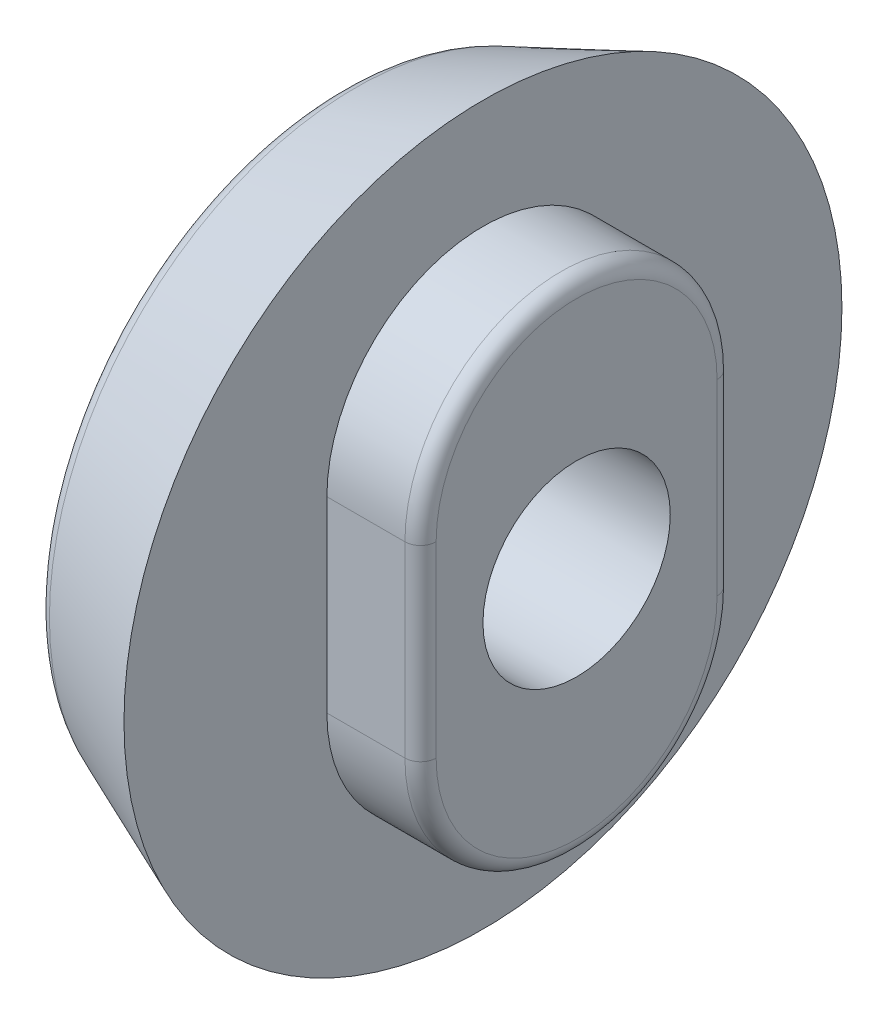
ISO-10303-21;
HEADER;
FILE_DESCRIPTION(('STEP AP214'),'2;1');
FILE_NAME('part.step','',(''),(''),'','','');
FILE_SCHEMA(('AUTOMOTIVE_DESIGN { 1 0 10303 214 1 1 1 1 }'));
ENDSEC;
DATA;
#1=APPLICATION_CONTEXT('core data for automotive mechanical design processes');
#2=APPLICATION_PROTOCOL_DEFINITION('international standard','automotive_design',2000,#1);
#3=PRODUCT_CONTEXT('',#1,'mechanical');
#4=PRODUCT('Part','Part','',(#3));
#5=PRODUCT_RELATED_PRODUCT_CATEGORY('part','',(#4));
#6=PRODUCT_DEFINITION_FORMATION('','',#4);
#7=PRODUCT_DEFINITION_CONTEXT('part definition',#1,'design');
#8=PRODUCT_DEFINITION('design','',#6,#7);
#9=PRODUCT_DEFINITION_SHAPE('','',#8);
#10=(LENGTH_UNIT() NAMED_UNIT(*) SI_UNIT(.MILLI.,.METRE.));
#11=(NAMED_UNIT(*) PLANE_ANGLE_UNIT() SI_UNIT($,.RADIAN.));
#12=(NAMED_UNIT(*) SI_UNIT($,.STERADIAN.) SOLID_ANGLE_UNIT());
#13=UNCERTAINTY_MEASURE_WITH_UNIT(LENGTH_MEASURE(1.E-05),#10,'distance_accuracy_value','');
#14=(GEOMETRIC_REPRESENTATION_CONTEXT(3) GLOBAL_UNCERTAINTY_ASSIGNED_CONTEXT((#13)) GLOBAL_UNIT_ASSIGNED_CONTEXT((#10,
#11,#12)) REPRESENTATION_CONTEXT('',''));
#15=CARTESIAN_POINT('',(0.,0.,0.));
#16=DIRECTION('',(0.,0.,1.));
#17=DIRECTION('',(1.,0.,0.));
#18=AXIS2_PLACEMENT_3D('',#15,#16,#17);
#19=CARTESIAN_POINT('',(0.,0.,0.));
#20=DIRECTION('',(-1.,0.,0.));
#21=DIRECTION('',(0.,0.,1.));
#22=AXIS2_PLACEMENT_3D('',#19,#20,#21);
#23=CYLINDRICAL_SURFACE('',#22,3.);
#24=CARTESIAN_POINT('',(6.,0.,0.));
#25=DIRECTION('',(1.,0.,0.));
#26=DIRECTION('',(0.,0.,-1.));
#27=AXIS2_PLACEMENT_3D('',#24,#25,#26);
#28=CIRCLE('',#27,3.);
#29=CARTESIAN_POINT('',(6.,0.,-3.));
#30=VERTEX_POINT('',#29);
#31=EDGE_CURVE('E178',#30,#30,#28,.T.);
#32=ORIENTED_EDGE('',*,*,#31,.T.);
#33=EDGE_LOOP('',(#32));
#34=FACE_BOUND('',#33,.T.);
#35=CARTESIAN_POINT('',(0.3,0.,0.));
#36=DIRECTION('',(-1.,0.,0.));
#37=DIRECTION('',(0.,0.,1.));
#38=AXIS2_PLACEMENT_3D('',#35,#36,#37);
#39=CIRCLE('',#38,3.);
#40=CARTESIAN_POINT('',(0.3,0.,3.));
#41=VERTEX_POINT('',#40);
#42=EDGE_CURVE('E37',#41,#41,#39,.F.);
#43=ORIENTED_EDGE('',*,*,#42,.F.);
#44=EDGE_LOOP('',(#43));
#45=FACE_BOUND('',#44,.T.);
#46=ADVANCED_FACE('F33',(#34,#45),#23,.F.);
#47=CARTESIAN_POINT('',(3.,0.,0.));
#48=DIRECTION('',(1.,0.,0.));
#49=DIRECTION('',(0.,0.,-1.));
#50=AXIS2_PLACEMENT_3D('',#47,#48,#49);
#51=PLANE('',#50);
#52=CARTESIAN_POINT('',(3.,0.,0.));
#53=DIRECTION('',(-1.,0.,0.));
#54=DIRECTION('',(0.,0.,1.));
#55=AXIS2_PLACEMENT_3D('',#52,#53,#54);
#56=CIRCLE('',#55,11.5);
#57=CARTESIAN_POINT('',(3.,0.,11.5));
#58=VERTEX_POINT('',#57);
#59=EDGE_CURVE('E202',#58,#58,#56,.T.);
#60=ORIENTED_EDGE('',*,*,#59,.F.);
#61=EDGE_LOOP('',(#60));
#62=FACE_BOUND('',#61,.T.);
#63=DIRECTION('',(0.,1.,0.));
#64=VECTOR('',#63,1.);
#65=CARTESIAN_POINT('',(3.,-3.,-5.));
#66=LINE('',#65,#64);
#67=CARTESIAN_POINT('',(3.,-3.,-5.));
#68=VERTEX_POINT('',#67);
#69=CARTESIAN_POINT('',(3.,3.,-5.));
#70=VERTEX_POINT('',#69);
#71=EDGE_CURVE('E185',#68,#70,#66,.T.);
#72=ORIENTED_EDGE('',*,*,#71,.F.);
#73=CARTESIAN_POINT('',(3.,-3.,0.));
#74=DIRECTION('',(1.,0.,0.));
#75=DIRECTION('',(0.,0.,-1.));
#76=AXIS2_PLACEMENT_3D('',#73,#74,#75);
#77=CIRCLE('',#76,5.);
#78=CARTESIAN_POINT('',(3.,-3.,5.));
#79=VERTEX_POINT('',#78);
#80=EDGE_CURVE('E181',#79,#68,#77,.T.);
#81=ORIENTED_EDGE('',*,*,#80,.F.);
#82=DIRECTION('',(0.,-1.,0.));
#83=VECTOR('',#82,1.);
#84=CARTESIAN_POINT('',(3.,-3.,5.));
#85=LINE('',#84,#83);
#86=CARTESIAN_POINT('',(3.,3.,5.));
#87=VERTEX_POINT('',#86);
#88=EDGE_CURVE('E191',#87,#79,#85,.T.);
#89=ORIENTED_EDGE('',*,*,#88,.F.);
#90=CARTESIAN_POINT('',(3.,3.,0.));
#91=DIRECTION('',(1.,0.,0.));
#92=DIRECTION('',(0.,0.,-1.));
#93=AXIS2_PLACEMENT_3D('',#90,#91,#92);
#94=CIRCLE('',#93,5.);
#95=EDGE_CURVE('E188',#70,#87,#94,.T.);
#96=ORIENTED_EDGE('',*,*,#95,.F.);
#97=EDGE_LOOP('',(#72,#81,#89,#96));
#98=FACE_BOUND('',#97,.T.);
#99=ADVANCED_FACE('F270',(#62,#98),#51,.T.);
#100=CARTESIAN_POINT('',(-1.7,0.,0.));
#101=DIRECTION('',(1.,0.,0.));
#102=DIRECTION('',(0.,0.,-1.));
#103=AXIS2_PLACEMENT_3D('',#100,#101,#102);
#104=PLANE('',#103);
#105=DIRECTION('',(0.,0.,-1.));
#106=VECTOR('',#105,1.);
#107=CARTESIAN_POINT('',(-1.7,6.92820323027549,3.99999999999998));
#108=LINE('',#107,#106);
#109=CARTESIAN_POINT('',(-1.7,6.92820323027549,3.99999999999998));
#110=VERTEX_POINT('',#109);
#111=CARTESIAN_POINT('',(-1.7,6.92820323027548,-3.99999999999999));
#112=VERTEX_POINT('',#111);
#113=EDGE_CURVE('E159',#110,#112,#108,.T.);
#114=ORIENTED_EDGE('',*,*,#113,.F.);
#115=DIRECTION('',(0.,0.866025403784439,-0.5));
#116=VECTOR('',#115,1.);
#117=CARTESIAN_POINT('',(-1.7,0.,7.99999999999997));
#118=LINE('',#117,#116);
#119=CARTESIAN_POINT('',(-1.7,0.,7.99999999999997));
#120=VERTEX_POINT('',#119);
#121=EDGE_CURVE('E50',#120,#110,#118,.T.);
#122=ORIENTED_EDGE('',*,*,#121,.F.);
#123=DIRECTION('',(0.,0.866025403784439,0.5));
#124=VECTOR('',#123,1.);
#125=CARTESIAN_POINT('',(-1.7,-6.92820323027548,3.99999999999999));
#126=LINE('',#125,#124);
#127=CARTESIAN_POINT('',(-1.7,-6.92820323027548,3.99999999999999));
#128=VERTEX_POINT('',#127);
#129=EDGE_CURVE('E145',#128,#120,#126,.T.);
#130=ORIENTED_EDGE('',*,*,#129,.F.);
#131=DIRECTION('',(0.,0.,1.));
#132=VECTOR('',#131,1.);
#133=CARTESIAN_POINT('',(-1.7,-6.92820323027549,-3.99999999999998));
#134=LINE('',#133,#132);
#135=CARTESIAN_POINT('',(-1.7,-6.92820323027549,-3.99999999999998));
#136=VERTEX_POINT('',#135);
#137=EDGE_CURVE('E148',#136,#128,#134,.T.);
#138=ORIENTED_EDGE('',*,*,#137,.F.);
#139=DIRECTION('',(0.,-0.866025403784438,0.5));
#140=VECTOR('',#139,1.);
#141=CARTESIAN_POINT('',(-1.7,0.,-7.99999999999997));
#142=LINE('',#141,#140);
#143=CARTESIAN_POINT('',(-1.7,0.,-7.99999999999997));
#144=VERTEX_POINT('',#143);
#145=EDGE_CURVE('E164',#144,#136,#142,.T.);
#146=ORIENTED_EDGE('',*,*,#145,.F.);
#147=DIRECTION('',(0.,-0.866025403784439,-0.5));
#148=VECTOR('',#147,1.);
#149=CARTESIAN_POINT('',(-1.7,6.92820323027548,-3.99999999999999));
#150=LINE('',#149,#148);
#151=EDGE_CURVE('E161',#112,#144,#150,.T.);
#152=ORIENTED_EDGE('',*,*,#151,.F.);
#153=EDGE_LOOP('',(#114,#122,#130,#138,#146,#152));
#154=FACE_BOUND('',#153,.T.);
#155=CARTESIAN_POINT('',(-1.7,0.,0.));
#156=DIRECTION('',(1.,0.,0.));
#157=DIRECTION('',(0.,0.,-1.));
#158=AXIS2_PLACEMENT_3D('',#155,#156,#157);
#159=CIRCLE('',#158,8.88224098877665);
#160=CARTESIAN_POINT('',(-1.7,0.,-8.88224098877665));
#161=VERTEX_POINT('',#160);
#162=EDGE_CURVE('E205',#161,#161,#159,.F.);
#163=ORIENTED_EDGE('',*,*,#162,.T.);
#164=EDGE_LOOP('',(#163));
#165=FACE_BOUND('',#164,.T.);
#166=ADVANCED_FACE('F314',(#154,#165),#104,.F.);
#167=CARTESIAN_POINT('',(-1.7,0.,0.));
#168=DIRECTION('',(1.,0.,0.));
#169=DIRECTION('',(0.,0.,-1.));
#170=AXIS2_PLACEMENT_3D('',#167,#168,#169);
#171=CONICAL_SURFACE('',#170,9.55,0.393279405053898);
#172=CARTESIAN_POINT('',(-1.08321951676594,0.,0.));
#173=DIRECTION('',(1.,0.,0.));
#174=DIRECTION('',(0.,0.,-1.));
#175=AXIS2_PLACEMENT_3D('',#172,#173,#174);
#176=CIRCLE('',#175,9.80589828559711);
#177=CARTESIAN_POINT('',(-1.08321951676594,0.,-9.80589828559711));
#178=VERTEX_POINT('',#177);
#179=EDGE_CURVE('E208',#178,#178,#176,.T.);
#180=ORIENTED_EDGE('',*,*,#179,.T.);
#181=EDGE_LOOP('',(#180));
#182=FACE_BOUND('',#181,.T.);
#183=ORIENTED_EDGE('',*,*,#59,.T.);
#184=EDGE_LOOP('',(#183));
#185=FACE_BOUND('',#184,.T.);
#186=ADVANCED_FACE('F311',(#182,#185),#171,.T.);
#187=CARTESIAN_POINT('',(-0.7,0.,0.));
#188=DIRECTION('',(1.,0.,0.));
#189=DIRECTION('',(0.,0.,-1.));
#190=AXIS2_PLACEMENT_3D('',#187,#188,#189);
#191=TOROIDAL_SURFACE('',#190,8.88224098877665,1.);
#192=ORIENTED_EDGE('',*,*,#179,.F.);
#193=EDGE_LOOP('',(#192));
#194=FACE_BOUND('',#193,.T.);
#195=ORIENTED_EDGE('',*,*,#162,.F.);
#196=EDGE_LOOP('',(#195));
#197=FACE_BOUND('',#196,.T.);
#198=ADVANCED_FACE('F264',(#194,#197),#191,.T.);
#199=CARTESIAN_POINT('',(6.,-3.,0.));
#200=DIRECTION('',(1.,0.,0.));
#201=DIRECTION('',(0.,0.,-1.));
#202=AXIS2_PLACEMENT_3D('',#199,#200,#201);
#203=PLANE('',#202);
#204=DIRECTION('',(0.,1.,0.));
#205=VECTOR('',#204,1.);
#206=CARTESIAN_POINT('',(6.,3.,-4.5));
#207=LINE('',#206,#205);
#208=CARTESIAN_POINT('',(6.,-3.,-4.5));
#209=VERTEX_POINT('',#208);
#210=CARTESIAN_POINT('',(6.,3.,-4.5));
#211=VERTEX_POINT('',#210);
#212=EDGE_CURVE('E215',#209,#211,#207,.T.);
#213=ORIENTED_EDGE('',*,*,#212,.T.);
#214=CARTESIAN_POINT('',(6.,3.,0.));
#215=DIRECTION('',(1.,0.,0.));
#216=DIRECTION('',(0.,0.,-1.));
#217=AXIS2_PLACEMENT_3D('',#214,#215,#216);
#218=CIRCLE('',#217,4.5);
#219=CARTESIAN_POINT('',(6.,3.,4.5));
#220=VERTEX_POINT('',#219);
#221=EDGE_CURVE('E217',#211,#220,#218,.T.);
#222=ORIENTED_EDGE('',*,*,#221,.T.);
#223=DIRECTION('',(0.,-1.,0.));
#224=VECTOR('',#223,1.);
#225=CARTESIAN_POINT('',(6.,-3.,4.5));
#226=LINE('',#225,#224);
#227=CARTESIAN_POINT('',(6.,-3.,4.5));
#228=VERTEX_POINT('',#227);
#229=EDGE_CURVE('E211',#220,#228,#226,.T.);
#230=ORIENTED_EDGE('',*,*,#229,.T.);
#231=CARTESIAN_POINT('',(6.,-3.,0.));
#232=DIRECTION('',(1.,0.,0.));
#233=DIRECTION('',(0.,0.,-1.));
#234=AXIS2_PLACEMENT_3D('',#231,#232,#233);
#235=CIRCLE('',#234,4.5);
#236=EDGE_CURVE('E213',#228,#209,#235,.T.);
#237=ORIENTED_EDGE('',*,*,#236,.T.);
#238=EDGE_LOOP('',(#213,#222,#230,#237));
#239=FACE_BOUND('',#238,.T.);
#240=ORIENTED_EDGE('',*,*,#31,.F.);
#241=EDGE_LOOP('',(#240));
#242=FACE_BOUND('',#241,.T.);
#243=ADVANCED_FACE('F260',(#239,#242),#203,.T.);
#244=CARTESIAN_POINT('',(6.,-3.,0.));
#245=DIRECTION('',(-1.,0.,0.));
#246=DIRECTION('',(0.,0.,1.));
#247=AXIS2_PLACEMENT_3D('',#244,#245,#246);
#248=CYLINDRICAL_SURFACE('',#247,5.);
#249=DIRECTION('',(-1.,0.,0.));
#250=VECTOR('',#249,1.);
#251=CARTESIAN_POINT('',(6.,-3.,-5.));
#252=LINE('',#251,#250);
#253=CARTESIAN_POINT('',(5.5,-3.,-5.));
#254=VERTEX_POINT('',#253);
#255=EDGE_CURVE('E200',#254,#68,#252,.T.);
#256=ORIENTED_EDGE('',*,*,#255,.F.);
#257=CARTESIAN_POINT('',(5.5,-3.,0.));
#258=DIRECTION('',(1.,0.,0.));
#259=DIRECTION('',(0.,0.,-1.));
#260=AXIS2_PLACEMENT_3D('',#257,#258,#259);
#261=CIRCLE('',#260,5.);
#262=CARTESIAN_POINT('',(5.5,-3.,5.));
#263=VERTEX_POINT('',#262);
#264=EDGE_CURVE('E42',#254,#263,#261,.F.);
#265=ORIENTED_EDGE('',*,*,#264,.T.);
#266=DIRECTION('',(-1.,0.,0.));
#267=VECTOR('',#266,1.);
#268=CARTESIAN_POINT('',(6.,-3.,5.));
#269=LINE('',#268,#267);
#270=EDGE_CURVE('E194',#263,#79,#269,.T.);
#271=ORIENTED_EDGE('',*,*,#270,.T.);
#272=ORIENTED_EDGE('',*,*,#80,.T.);
#273=EDGE_LOOP('',(#256,#265,#271,#272));
#274=FACE_BOUND('',#273,.T.);
#275=ADVANCED_FACE('F263',(#274),#248,.T.);
#276=CARTESIAN_POINT('',(6.,-3.,-5.));
#277=DIRECTION('',(0.,0.,1.));
#278=DIRECTION('',(1.,0.,0.));
#279=AXIS2_PLACEMENT_3D('',#276,#277,#278);
#280=PLANE('',#279);
#281=DIRECTION('',(-1.,0.,0.));
#282=VECTOR('',#281,1.);
#283=CARTESIAN_POINT('',(6.,3.,-5.));
#284=LINE('',#283,#282);
#285=CARTESIAN_POINT('',(5.5,3.,-5.));
#286=VERTEX_POINT('',#285);
#287=EDGE_CURVE('E198',#286,#70,#284,.T.);
#288=ORIENTED_EDGE('',*,*,#287,.F.);
#289=DIRECTION('',(0.,1.,0.));
#290=VECTOR('',#289,1.);
#291=CARTESIAN_POINT('',(5.5,-3.,-5.));
#292=LINE('',#291,#290);
#293=EDGE_CURVE('E223',#286,#254,#292,.F.);
#294=ORIENTED_EDGE('',*,*,#293,.T.);
#295=ORIENTED_EDGE('',*,*,#255,.T.);
#296=ORIENTED_EDGE('',*,*,#71,.T.);
#297=EDGE_LOOP('',(#288,#294,#295,#296));
#298=FACE_BOUND('',#297,.T.);
#299=ADVANCED_FACE('F305',(#298),#280,.F.);
#300=CARTESIAN_POINT('',(6.,3.,0.));
#301=DIRECTION('',(-1.,0.,0.));
#302=DIRECTION('',(0.,0.,1.));
#303=AXIS2_PLACEMENT_3D('',#300,#301,#302);
#304=CYLINDRICAL_SURFACE('',#303,5.);
#305=DIRECTION('',(-1.,0.,0.));
#306=VECTOR('',#305,1.);
#307=CARTESIAN_POINT('',(6.,3.,5.));
#308=LINE('',#307,#306);
#309=CARTESIAN_POINT('',(5.5,3.,5.));
#310=VERTEX_POINT('',#309);
#311=EDGE_CURVE('E196',#310,#87,#308,.T.);
#312=ORIENTED_EDGE('',*,*,#311,.F.);
#313=CARTESIAN_POINT('',(5.5,3.,0.));
#314=DIRECTION('',(1.,0.,0.));
#315=DIRECTION('',(0.,0.,-1.));
#316=AXIS2_PLACEMENT_3D('',#313,#314,#315);
#317=CIRCLE('',#316,5.);
#318=EDGE_CURVE('E220',#310,#286,#317,.F.);
#319=ORIENTED_EDGE('',*,*,#318,.T.);
#320=ORIENTED_EDGE('',*,*,#287,.T.);
#321=ORIENTED_EDGE('',*,*,#95,.T.);
#322=EDGE_LOOP('',(#312,#319,#320,#321));
#323=FACE_BOUND('',#322,.T.);
#324=ADVANCED_FACE('F252',(#323),#304,.T.);
#325=CARTESIAN_POINT('',(6.,-3.,5.));
#326=DIRECTION('',(0.,0.,-1.));
#327=DIRECTION('',(-1.,0.,0.));
#328=AXIS2_PLACEMENT_3D('',#325,#326,#327);
#329=PLANE('',#328);
#330=ORIENTED_EDGE('',*,*,#270,.F.);
#331=DIRECTION('',(0.,-1.,0.));
#332=VECTOR('',#331,1.);
#333=CARTESIAN_POINT('',(5.5,3.,5.));
#334=LINE('',#333,#332);
#335=EDGE_CURVE('E11',#263,#310,#334,.F.);
#336=ORIENTED_EDGE('',*,*,#335,.T.);
#337=ORIENTED_EDGE('',*,*,#311,.T.);
#338=ORIENTED_EDGE('',*,*,#88,.T.);
#339=EDGE_LOOP('',(#330,#336,#337,#338));
#340=FACE_BOUND('',#339,.T.);
#341=ADVANCED_FACE('F249',(#340),#329,.F.);
#342=CARTESIAN_POINT('',(5.5,-3.,0.));
#343=DIRECTION('',(1.,0.,0.));
#344=DIRECTION('',(0.,0.,-1.));
#345=AXIS2_PLACEMENT_3D('',#342,#343,#344);
#346=TOROIDAL_SURFACE('',#345,4.5,0.5);
#347=CARTESIAN_POINT('',(5.5,-3.,4.5));
#348=DIRECTION('',(0.,1.,0.));
#349=DIRECTION('',(0.,0.,1.));
#350=AXIS2_PLACEMENT_3D('',#347,#348,#349);
#351=CIRCLE('',#350,0.5);
#352=EDGE_CURVE('E230',#263,#228,#351,.T.);
#353=ORIENTED_EDGE('',*,*,#352,.F.);
#354=ORIENTED_EDGE('',*,*,#264,.F.);
#355=CARTESIAN_POINT('',(5.5,-3.,-4.5));
#356=DIRECTION('',(0.,1.,0.));
#357=DIRECTION('',(0.,0.,1.));
#358=AXIS2_PLACEMENT_3D('',#355,#356,#357);
#359=CIRCLE('',#358,0.5);
#360=EDGE_CURVE('E182',#209,#254,#359,.T.);
#361=ORIENTED_EDGE('',*,*,#360,.F.);
#362=ORIENTED_EDGE('',*,*,#236,.F.);
#363=EDGE_LOOP('',(#353,#354,#361,#362));
#364=FACE_BOUND('',#363,.T.);
#365=ADVANCED_FACE('F35',(#364),#346,.T.);
#366=CARTESIAN_POINT('',(5.5,-3.,-4.5));
#367=DIRECTION('',(0.,-1.,0.));
#368=DIRECTION('',(0.,0.,-1.));
#369=AXIS2_PLACEMENT_3D('',#366,#367,#368);
#370=CYLINDRICAL_SURFACE('',#369,0.5);
#371=ORIENTED_EDGE('',*,*,#360,.T.);
#372=ORIENTED_EDGE('',*,*,#293,.F.);
#373=CARTESIAN_POINT('',(5.5,3.,-4.5));
#374=DIRECTION('',(0.,1.,0.));
#375=DIRECTION('',(0.,0.,1.));
#376=AXIS2_PLACEMENT_3D('',#373,#374,#375);
#377=CIRCLE('',#376,0.5);
#378=EDGE_CURVE('E228',#211,#286,#377,.T.);
#379=ORIENTED_EDGE('',*,*,#378,.F.);
#380=ORIENTED_EDGE('',*,*,#212,.F.);
#381=EDGE_LOOP('',(#371,#372,#379,#380));
#382=FACE_BOUND('',#381,.T.);
#383=ADVANCED_FACE('F237',(#382),#370,.T.);
#384=CARTESIAN_POINT('',(5.5,-3.,4.5));
#385=DIRECTION('',(0.,1.,0.));
#386=DIRECTION('',(0.,0.,1.));
#387=AXIS2_PLACEMENT_3D('',#384,#385,#386);
#388=CYLINDRICAL_SURFACE('',#387,0.5);
#389=ORIENTED_EDGE('',*,*,#352,.T.);
#390=ORIENTED_EDGE('',*,*,#229,.F.);
#391=CARTESIAN_POINT('',(5.5,3.,4.5));
#392=DIRECTION('',(0.,1.,0.));
#393=DIRECTION('',(0.,0.,1.));
#394=AXIS2_PLACEMENT_3D('',#391,#392,#393);
#395=CIRCLE('',#394,0.5);
#396=EDGE_CURVE('E226',#310,#220,#395,.T.);
#397=ORIENTED_EDGE('',*,*,#396,.F.);
#398=ORIENTED_EDGE('',*,*,#335,.F.);
#399=EDGE_LOOP('',(#389,#390,#397,#398));
#400=FACE_BOUND('',#399,.T.);
#401=ADVANCED_FACE('F246',(#400),#388,.T.);
#402=CARTESIAN_POINT('',(5.5,3.,0.));
#403=DIRECTION('',(1.,0.,0.));
#404=DIRECTION('',(0.,0.,-1.));
#405=AXIS2_PLACEMENT_3D('',#402,#403,#404);
#406=TOROIDAL_SURFACE('',#405,4.5,0.5);
#407=ORIENTED_EDGE('',*,*,#378,.T.);
#408=ORIENTED_EDGE('',*,*,#318,.F.);
#409=ORIENTED_EDGE('',*,*,#396,.T.);
#410=ORIENTED_EDGE('',*,*,#221,.F.);
#411=EDGE_LOOP('',(#407,#408,#409,#410));
#412=FACE_BOUND('',#411,.T.);
#413=ADVANCED_FACE('F257',(#412),#406,.T.);
#414=CARTESIAN_POINT('',(0.3,0.,0.));
#415=DIRECTION('',(-1.,0.,0.));
#416=DIRECTION('',(0.,0.,1.));
#417=AXIS2_PLACEMENT_3D('',#414,#415,#416);
#418=PLANE('',#417);
#419=DIRECTION('',(0.,0.866025403784439,-0.5));
#420=VECTOR('',#419,1.);
#421=CARTESIAN_POINT('',(0.3,0.,7.99999999999997));
#422=LINE('',#421,#420);
#423=CARTESIAN_POINT('',(0.3,0.,7.99999999999997));
#424=VERTEX_POINT('',#423);
#425=CARTESIAN_POINT('',(0.3,6.92820323027549,3.99999999999998));
#426=VERTEX_POINT('',#425);
#427=EDGE_CURVE('E125',#424,#426,#422,.T.);
#428=ORIENTED_EDGE('',*,*,#427,.T.);
#429=DIRECTION('',(0.,0.,-1.));
#430=VECTOR('',#429,1.);
#431=CARTESIAN_POINT('',(0.3,6.92820323027549,3.99999999999998));
#432=LINE('',#431,#430);
#433=CARTESIAN_POINT('',(0.3,6.92820323027548,-3.99999999999999));
#434=VERTEX_POINT('',#433);
#435=EDGE_CURVE('E134',#426,#434,#432,.T.);
#436=ORIENTED_EDGE('',*,*,#435,.T.);
#437=DIRECTION('',(0.,-0.866025403784439,-0.5));
#438=VECTOR('',#437,1.);
#439=CARTESIAN_POINT('',(0.3,6.92820323027548,-3.99999999999999));
#440=LINE('',#439,#438);
#441=CARTESIAN_POINT('',(0.3,0.,-7.99999999999997));
#442=VERTEX_POINT('',#441);
#443=EDGE_CURVE('E139',#434,#442,#440,.T.);
#444=ORIENTED_EDGE('',*,*,#443,.T.);
#445=DIRECTION('',(0.,-0.866025403784438,0.5));
#446=VECTOR('',#445,1.);
#447=CARTESIAN_POINT('',(0.3,0.,-7.99999999999997));
#448=LINE('',#447,#446);
#449=CARTESIAN_POINT('',(0.3,-6.92820323027549,-3.99999999999998));
#450=VERTEX_POINT('',#449);
#451=EDGE_CURVE('E152',#442,#450,#448,.T.);
#452=ORIENTED_EDGE('',*,*,#451,.T.);
#453=DIRECTION('',(0.,0.,1.));
#454=VECTOR('',#453,1.);
#455=CARTESIAN_POINT('',(0.3,-6.92820323027549,-3.99999999999998));
#456=LINE('',#455,#454);
#457=CARTESIAN_POINT('',(0.3,-6.92820323027548,3.99999999999999));
#458=VERTEX_POINT('',#457);
#459=EDGE_CURVE('E155',#450,#458,#456,.T.);
#460=ORIENTED_EDGE('',*,*,#459,.T.);
#461=DIRECTION('',(0.,0.866025403784439,0.5));
#462=VECTOR('',#461,1.);
#463=CARTESIAN_POINT('',(0.3,-6.92820323027548,3.99999999999999));
#464=LINE('',#463,#462);
#465=EDGE_CURVE('E131',#458,#424,#464,.T.);
#466=ORIENTED_EDGE('',*,*,#465,.T.);
#467=EDGE_LOOP('',(#428,#436,#444,#452,#460,#466));
#468=FACE_BOUND('',#467,.T.);
#469=ORIENTED_EDGE('',*,*,#42,.T.);
#470=EDGE_LOOP('',(#469));
#471=FACE_BOUND('',#470,.T.);
#472=ADVANCED_FACE('F141',(#468,#471),#418,.T.);
#473=CARTESIAN_POINT('',(0.3,0.,7.99999999999997));
#474=DIRECTION('',(0.,0.5,0.866025403784439));
#475=DIRECTION('',(0.,-0.866025403784439,0.5));
#476=AXIS2_PLACEMENT_3D('',#473,#474,#475);
#477=PLANE('',#476);
#478=ORIENTED_EDGE('',*,*,#121,.T.);
#479=DIRECTION('',(-1.,0.,0.));
#480=VECTOR('',#479,1.);
#481=CARTESIAN_POINT('',(0.3,6.92820323027549,3.99999999999998));
#482=LINE('',#481,#480);
#483=EDGE_CURVE('E121',#426,#110,#482,.T.);
#484=ORIENTED_EDGE('',*,*,#483,.F.);
#485=ORIENTED_EDGE('',*,*,#427,.F.);
#486=DIRECTION('',(-1.,0.,0.));
#487=VECTOR('',#486,1.);
#488=CARTESIAN_POINT('',(0.3,0.,7.99999999999997));
#489=LINE('',#488,#487);
#490=EDGE_CURVE('E169',#424,#120,#489,.T.);
#491=ORIENTED_EDGE('',*,*,#490,.T.);
#492=EDGE_LOOP('',(#478,#484,#485,#491));
#493=FACE_BOUND('',#492,.T.);
#494=ADVANCED_FACE('F123',(#493),#477,.F.);
#495=CARTESIAN_POINT('',(0.3,-6.92820323027548,3.99999999999999));
#496=DIRECTION('',(0.,-0.5,0.866025403784439));
#497=DIRECTION('',(0.,-0.866025403784439,-0.5));
#498=AXIS2_PLACEMENT_3D('',#495,#496,#497);
#499=PLANE('',#498);
#500=ORIENTED_EDGE('',*,*,#129,.T.);
#501=ORIENTED_EDGE('',*,*,#490,.F.);
#502=ORIENTED_EDGE('',*,*,#465,.F.);
#503=DIRECTION('',(-1.,0.,0.));
#504=VECTOR('',#503,1.);
#505=CARTESIAN_POINT('',(0.3,-6.92820323027548,3.99999999999999));
#506=LINE('',#505,#504);
#507=EDGE_CURVE('E171',#458,#128,#506,.T.);
#508=ORIENTED_EDGE('',*,*,#507,.T.);
#509=EDGE_LOOP('',(#500,#501,#502,#508));
#510=FACE_BOUND('',#509,.T.);
#511=ADVANCED_FACE('F280',(#510),#499,.F.);
#512=CARTESIAN_POINT('',(0.3,-6.92820323027549,-3.99999999999998));
#513=DIRECTION('',(0.,-1.,0.));
#514=DIRECTION('',(0.,0.,-1.));
#515=AXIS2_PLACEMENT_3D('',#512,#513,#514);
#516=PLANE('',#515);
#517=ORIENTED_EDGE('',*,*,#137,.T.);
#518=ORIENTED_EDGE('',*,*,#507,.F.);
#519=ORIENTED_EDGE('',*,*,#459,.F.);
#520=DIRECTION('',(-1.,0.,0.));
#521=VECTOR('',#520,1.);
#522=CARTESIAN_POINT('',(0.3,-6.92820323027549,-3.99999999999998));
#523=LINE('',#522,#521);
#524=EDGE_CURVE('E173',#450,#136,#523,.T.);
#525=ORIENTED_EDGE('',*,*,#524,.T.);
#526=EDGE_LOOP('',(#517,#518,#519,#525));
#527=FACE_BOUND('',#526,.T.);
#528=ADVANCED_FACE('F286',(#527),#516,.F.);
#529=CARTESIAN_POINT('',(0.3,0.,-7.99999999999997));
#530=DIRECTION('',(0.,-0.5,-0.866025403784439));
#531=DIRECTION('',(0.,0.866025403784439,-0.5));
#532=AXIS2_PLACEMENT_3D('',#529,#530,#531);
#533=PLANE('',#532);
#534=ORIENTED_EDGE('',*,*,#145,.T.);
#535=ORIENTED_EDGE('',*,*,#524,.F.);
#536=ORIENTED_EDGE('',*,*,#451,.F.);
#537=DIRECTION('',(-1.,0.,0.));
#538=VECTOR('',#537,1.);
#539=CARTESIAN_POINT('',(0.3,0.,-7.99999999999997));
#540=LINE('',#539,#538);
#541=EDGE_CURVE('E175',#442,#144,#540,.T.);
#542=ORIENTED_EDGE('',*,*,#541,.T.);
#543=EDGE_LOOP('',(#534,#535,#536,#542));
#544=FACE_BOUND('',#543,.T.);
#545=ADVANCED_FACE('F290',(#544),#533,.F.);
#546=CARTESIAN_POINT('',(0.3,6.92820323027548,-3.99999999999999));
#547=DIRECTION('',(0.,0.5,-0.866025403784439));
#548=DIRECTION('',(0.,0.866025403784439,0.5));
#549=AXIS2_PLACEMENT_3D('',#546,#547,#548);
#550=PLANE('',#549);
#551=ORIENTED_EDGE('',*,*,#151,.T.);
#552=ORIENTED_EDGE('',*,*,#541,.F.);
#553=ORIENTED_EDGE('',*,*,#443,.F.);
#554=DIRECTION('',(-1.,0.,0.));
#555=VECTOR('',#554,1.);
#556=CARTESIAN_POINT('',(0.3,6.92820323027548,-3.99999999999999));
#557=LINE('',#556,#555);
#558=EDGE_CURVE('E130',#434,#112,#557,.T.);
#559=ORIENTED_EDGE('',*,*,#558,.T.);
#560=EDGE_LOOP('',(#551,#552,#553,#559));
#561=FACE_BOUND('',#560,.T.);
#562=ADVANCED_FACE('F294',(#561),#550,.F.);
#563=CARTESIAN_POINT('',(0.3,6.92820323027549,3.99999999999998));
#564=DIRECTION('',(0.,1.,0.));
#565=DIRECTION('',(0.,0.,1.));
#566=AXIS2_PLACEMENT_3D('',#563,#564,#565);
#567=PLANE('',#566);
#568=ORIENTED_EDGE('',*,*,#113,.T.);
#569=ORIENTED_EDGE('',*,*,#558,.F.);
#570=ORIENTED_EDGE('',*,*,#435,.F.);
#571=ORIENTED_EDGE('',*,*,#483,.T.);
#572=EDGE_LOOP('',(#568,#569,#570,#571));
#573=FACE_BOUND('',#572,.T.);
#574=ADVANCED_FACE('F135',(#573),#567,.F.);
#575=CLOSED_SHELL('',(#46,#99,#166,#186,#198,#243,#275,#299,#324,#341,#365,#383,#401,#413,#472,
#494,#511,#528,#545,#562,#574));
#576=MANIFOLD_SOLID_BREP('B2',#575);
#577=ADVANCED_BREP_SHAPE_REPRESENTATION('',(#18,#576),#14);
#578=SHAPE_DEFINITION_REPRESENTATION(#9,#577);
ENDSEC;
END-ISO-10303-21;
